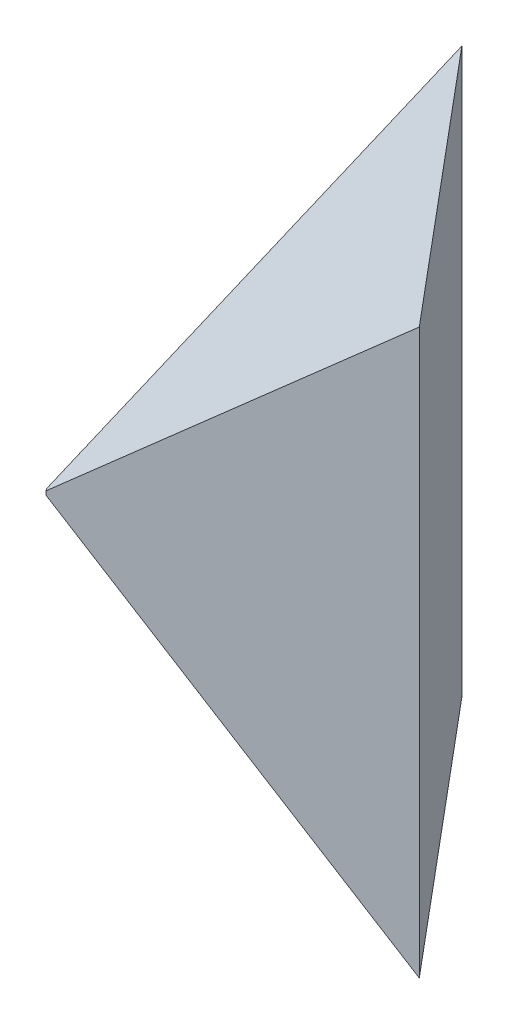
ISO-10303-21;
HEADER;
FILE_DESCRIPTION(('STEP AP214'),'2;1');
FILE_NAME('part.step','',(''),(''),'','','');
FILE_SCHEMA(('AUTOMOTIVE_DESIGN { 1 0 10303 214 1 1 1 1 }'));
ENDSEC;
DATA;
#1=APPLICATION_CONTEXT('core data for automotive mechanical design processes');
#2=APPLICATION_PROTOCOL_DEFINITION('international standard','automotive_design',2000,#1);
#3=PRODUCT_CONTEXT('',#1,'mechanical');
#4=PRODUCT('Part','Part','',(#3));
#5=PRODUCT_RELATED_PRODUCT_CATEGORY('part','',(#4));
#6=PRODUCT_DEFINITION_FORMATION('','',#4);
#7=PRODUCT_DEFINITION_CONTEXT('part definition',#1,'design');
#8=PRODUCT_DEFINITION('design','',#6,#7);
#9=PRODUCT_DEFINITION_SHAPE('','',#8);
#10=(LENGTH_UNIT() NAMED_UNIT(*) SI_UNIT(.MILLI.,.METRE.));
#11=(NAMED_UNIT(*) PLANE_ANGLE_UNIT() SI_UNIT($,.RADIAN.));
#12=(NAMED_UNIT(*) SI_UNIT($,.STERADIAN.) SOLID_ANGLE_UNIT());
#13=UNCERTAINTY_MEASURE_WITH_UNIT(LENGTH_MEASURE(1.E-05),#10,'distance_accuracy_value','');
#14=(GEOMETRIC_REPRESENTATION_CONTEXT(3) GLOBAL_UNCERTAINTY_ASSIGNED_CONTEXT((#13)) GLOBAL_UNIT_ASSIGNED_CONTEXT((#10,
#11,#12)) REPRESENTATION_CONTEXT('',''));
#15=CARTESIAN_POINT('',(0.,0.,0.));
#16=DIRECTION('',(0.,0.,1.));
#17=DIRECTION('',(1.,0.,0.));
#18=AXIS2_PLACEMENT_3D('',#15,#16,#17);
#19=CARTESIAN_POINT('',(550.80056683077,439.4553509639,-111.2295930181));
#20=DIRECTION('',(-0.54167522041975,0.707106781186674,0.45451947767179));
#21=DIRECTION('',(0.642787609686295,0.,0.766044443119183));
#22=AXIS2_PLACEMENT_3D('',#19,#20,#21);
#23=PLANE('',#22);
#24=DIRECTION('',(-0.642787609686799,0.,-0.76604444311876));
#25=VECTOR('',#24,1.);
#26=CARTESIAN_POINT('',(211.14845211481,-6.5,177.77214424733));
#27=LINE('',#26,#25);
#28=CARTESIAN_POINT('',(211.14845211481,-6.5,177.77214424733));
#29=VERTEX_POINT('',#28);
#30=CARTESIAN_POINT('',(207.20944457659,-6.5,173.07781786239));
#31=VERTEX_POINT('',#30);
#32=EDGE_CURVE('E93',#29,#31,#27,.T.);
#33=ORIENTED_EDGE('',*,*,#32,.F.);
#34=DIRECTION('',(-0.752588687610631,-0.648814003967682,0.112475132966945));
#35=VECTOR('',#34,1.);
#36=CARTESIAN_POINT('',(1017.310363989,688.5,57.290439268188));
#37=LINE('',#36,#35);
#38=CARTESIAN_POINT('',(1017.310363989,688.5,57.290439268188));
#39=VERTEX_POINT('',#38);
#40=EDGE_CURVE('E80',#39,#29,#37,.T.);
#41=ORIENTED_EDGE('',*,*,#40,.F.);
#42=DIRECTION('',(0.642787609686799,0.,0.76604444311876));
#43=VECTOR('',#42,1.);
#44=CARTESIAN_POINT('',(465.84930863764,688.5,-599.9152546227));
#45=LINE('',#44,#43);
#46=CARTESIAN_POINT('',(465.84930863764,688.5,-599.9152546227));
#47=VERTEX_POINT('',#46);
#48=EDGE_CURVE('E50',#47,#39,#45,.T.);
#49=ORIENTED_EDGE('',*,*,#48,.F.);
#50=DIRECTION('',(0.241452037103851,0.648814003967599,-0.721624072515554));
#51=VECTOR('',#50,1.);
#52=CARTESIAN_POINT('',(207.20944457659,-6.5,173.07781786239));
#53=LINE('',#52,#51);
#54=EDGE_CURVE('E9',#31,#47,#53,.T.);
#55=ORIENTED_EDGE('',*,*,#54,.F.);
#56=EDGE_LOOP('',(#33,#41,#49,#55));
#57=FACE_BOUND('',#56,.T.);
#58=ADVANCED_FACE('F14',(#57),#23,.T.);
#59=CARTESIAN_POINT('',(387.13071566378,-11.5,-364.6501795134));
#60=DIRECTION('',(-0.948323655206207,0.,-0.317304656405069));
#61=DIRECTION('',(-0.317304656405069,0.,0.948323655206207));
#62=AXIS2_PLACEMENT_3D('',#59,#60,#61);
#63=PLANE('',#62);
#64=DIRECTION('',(0.,-1.,0.));
#65=VECTOR('',#64,1.);
#66=CARTESIAN_POINT('',(207.20944457659,-6.5,173.07781786239));
#67=LINE('',#66,#65);
#68=CARTESIAN_POINT('',(207.20944457659,-16.5,173.07781786239));
#69=VERTEX_POINT('',#68);
#70=EDGE_CURVE('E98',#31,#69,#67,.T.);
#71=ORIENTED_EDGE('',*,*,#70,.F.);
#72=ORIENTED_EDGE('',*,*,#54,.T.);
#73=DIRECTION('',(0.,1.,0.));
#74=VECTOR('',#73,1.);
#75=CARTESIAN_POINT('',(465.84930863764,-711.5,-599.9152546227));
#76=LINE('',#75,#74);
#77=CARTESIAN_POINT('',(465.84930863764,-711.5,-599.9152546227));
#78=VERTEX_POINT('',#77);
#79=EDGE_CURVE('E109',#78,#47,#76,.T.);
#80=ORIENTED_EDGE('',*,*,#79,.F.);
#81=DIRECTION('',(0.241452037103851,-0.648814003967599,-0.721624072515554));
#82=VECTOR('',#81,1.);
#83=CARTESIAN_POINT('',(207.20944457659,-16.5,173.07781786239));
#84=LINE('',#83,#82);
#85=EDGE_CURVE('E25',#69,#78,#84,.T.);
#86=ORIENTED_EDGE('',*,*,#85,.F.);
#87=EDGE_LOOP('',(#71,#72,#80,#86));
#88=FACE_BOUND('',#87,.T.);
#89=ADVANCED_FACE('F119',(#88),#63,.T.);
#90=CARTESIAN_POINT('',(550.80056683077,-462.4553509639,-111.2295930181));
#91=DIRECTION('',(-0.54167522041975,-0.707106781186674,0.45451947767179));
#92=DIRECTION('',(-0.793844806099472,0.608120402411309,0.));
#93=AXIS2_PLACEMENT_3D('',#90,#91,#92);
#94=PLANE('',#93);
#95=DIRECTION('',(0.642787609686799,0.,0.76604444311876));
#96=VECTOR('',#95,1.);
#97=CARTESIAN_POINT('',(207.20944457659,-16.5,173.07781786239));
#98=LINE('',#97,#96);
#99=CARTESIAN_POINT('',(211.14845211481,-16.5,177.77214424733));
#100=VERTEX_POINT('',#99);
#101=EDGE_CURVE('E18',#69,#100,#98,.T.);
#102=ORIENTED_EDGE('',*,*,#101,.F.);
#103=ORIENTED_EDGE('',*,*,#85,.T.);
#104=DIRECTION('',(-0.642787609686799,0.,-0.76604444311876));
#105=VECTOR('',#104,1.);
#106=CARTESIAN_POINT('',(1017.310363989,-711.5,57.290439268188));
#107=LINE('',#106,#105);
#108=CARTESIAN_POINT('',(1017.310363989,-711.5,57.290439268188));
#109=VERTEX_POINT('',#108);
#110=EDGE_CURVE('E61',#109,#78,#107,.T.);
#111=ORIENTED_EDGE('',*,*,#110,.F.);
#112=DIRECTION('',(0.752588687610631,-0.648814003967682,-0.112475132966945));
#113=VECTOR('',#112,1.);
#114=CARTESIAN_POINT('',(211.14845211481,-16.5,177.77214424733));
#115=LINE('',#114,#113);
#116=EDGE_CURVE('E95',#100,#109,#115,.T.);
#117=ORIENTED_EDGE('',*,*,#116,.F.);
#118=EDGE_LOOP('',(#102,#103,#111,#117));
#119=FACE_BOUND('',#118,.T.);
#120=ADVANCED_FACE('F16',(#119),#94,.T.);
#121=CARTESIAN_POINT('',(741.57983631339,-11.5,-271.3124076772));
#122=DIRECTION('',(0.76604444311876,0.,-0.642787609686799));
#123=DIRECTION('',(0.,-1.,0.));
#124=AXIS2_PLACEMENT_3D('',#121,#122,#123);
#125=PLANE('',#124);
#126=DIRECTION('',(0.,-1.,0.));
#127=VECTOR('',#126,1.);
#128=CARTESIAN_POINT('',(1017.310363989,688.5,57.290439268188));
#129=LINE('',#128,#127);
#130=EDGE_CURVE('E86',#39,#109,#129,.T.);
#131=ORIENTED_EDGE('',*,*,#130,.T.);
#132=ORIENTED_EDGE('',*,*,#110,.T.);
#133=ORIENTED_EDGE('',*,*,#79,.T.);
#134=ORIENTED_EDGE('',*,*,#48,.T.);
#135=EDGE_LOOP('',(#131,#132,#133,#134));
#136=FACE_BOUND('',#135,.T.);
#137=ADVANCED_FACE('F118',(#136),#125,.T.);
#138=CARTESIAN_POINT('',(771.95015379012,-11.5,93.959768373663));
#139=DIRECTION('',(0.147809411129979,0.,0.989015863361862));
#140=DIRECTION('',(0.,-1.,0.));
#141=AXIS2_PLACEMENT_3D('',#138,#139,#140);
#142=PLANE('',#141);
#143=DIRECTION('',(0.,1.,0.));
#144=VECTOR('',#143,1.);
#145=CARTESIAN_POINT('',(211.14845211481,-16.5,177.77214424733));
#146=LINE('',#145,#144);
#147=EDGE_CURVE('E84',#100,#29,#146,.T.);
#148=ORIENTED_EDGE('',*,*,#147,.F.);
#149=ORIENTED_EDGE('',*,*,#116,.T.);
#150=ORIENTED_EDGE('',*,*,#130,.F.);
#151=ORIENTED_EDGE('',*,*,#40,.T.);
#152=EDGE_LOOP('',(#148,#149,#150,#151));
#153=FACE_BOUND('',#152,.T.);
#154=ADVANCED_FACE('F82',(#153),#142,.T.);
#155=CARTESIAN_POINT('',(209.1789483457,-11.5,175.42498105486));
#156=DIRECTION('',(-0.76604444311876,0.,0.642787609686799));
#157=DIRECTION('',(0.,1.,0.));
#158=AXIS2_PLACEMENT_3D('',#155,#156,#157);
#159=PLANE('',#158);
#160=ORIENTED_EDGE('',*,*,#32,.T.);
#161=ORIENTED_EDGE('',*,*,#70,.T.);
#162=ORIENTED_EDGE('',*,*,#101,.T.);
#163=ORIENTED_EDGE('',*,*,#147,.T.);
#164=EDGE_LOOP('',(#160,#161,#162,#163));
#165=FACE_BOUND('',#164,.T.);
#166=ADVANCED_FACE('F91',(#165),#159,.T.);
#167=CLOSED_SHELL('',(#58,#89,#120,#137,#154,#166));
#168=MANIFOLD_SOLID_BREP('B1',#167);
#169=ADVANCED_BREP_SHAPE_REPRESENTATION('',(#18,#168),#14);
#170=SHAPE_DEFINITION_REPRESENTATION(#9,#169);
ENDSEC;
END-ISO-10303-21;
